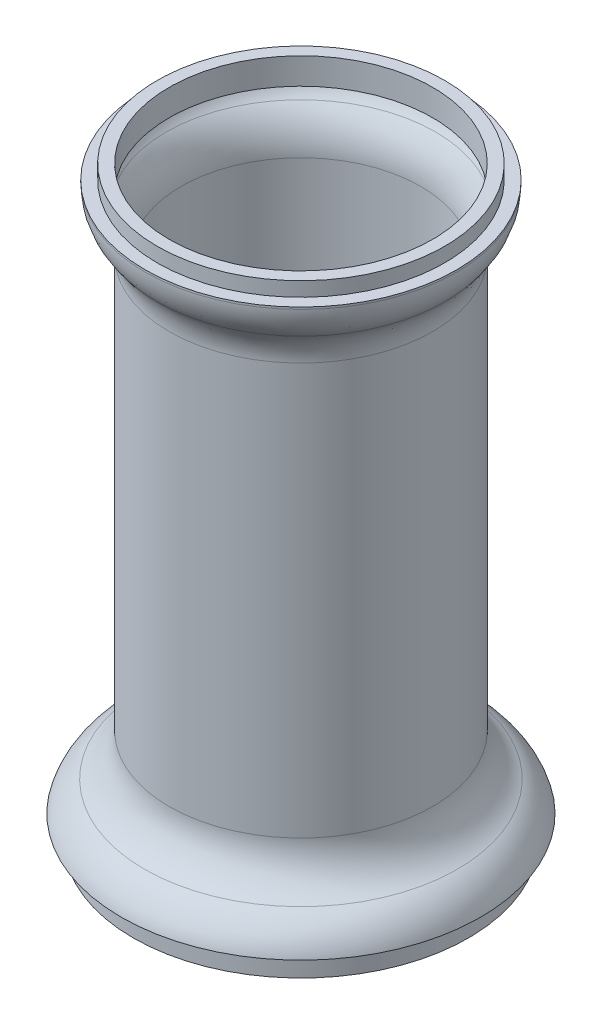
ISO-10303-21;
HEADER;
FILE_DESCRIPTION(('STEP AP214'),'2;1');
FILE_NAME('part.step','',(''),(''),'','','');
FILE_SCHEMA(('AUTOMOTIVE_DESIGN { 1 0 10303 214 1 1 1 1 }'));
ENDSEC;
DATA;
#1=APPLICATION_CONTEXT('core data for automotive mechanical design processes');
#2=APPLICATION_PROTOCOL_DEFINITION('international standard','automotive_design',2000,#1);
#3=PRODUCT_CONTEXT('',#1,'mechanical');
#4=PRODUCT('Part','Part','',(#3));
#5=PRODUCT_RELATED_PRODUCT_CATEGORY('part','',(#4));
#6=PRODUCT_DEFINITION_FORMATION('','',#4);
#7=PRODUCT_DEFINITION_CONTEXT('part definition',#1,'design');
#8=PRODUCT_DEFINITION('design','',#6,#7);
#9=PRODUCT_DEFINITION_SHAPE('','',#8);
#10=(LENGTH_UNIT() NAMED_UNIT(*) SI_UNIT(.MILLI.,.METRE.));
#11=(NAMED_UNIT(*) PLANE_ANGLE_UNIT() SI_UNIT($,.RADIAN.));
#12=(NAMED_UNIT(*) SI_UNIT($,.STERADIAN.) SOLID_ANGLE_UNIT());
#13=UNCERTAINTY_MEASURE_WITH_UNIT(LENGTH_MEASURE(1.E-05),#10,'distance_accuracy_value','');
#14=(GEOMETRIC_REPRESENTATION_CONTEXT(3) GLOBAL_UNCERTAINTY_ASSIGNED_CONTEXT((#13)) GLOBAL_UNIT_ASSIGNED_CONTEXT((#10,
#11,#12)) REPRESENTATION_CONTEXT('',''));
#15=CARTESIAN_POINT('',(0.,0.,0.));
#16=DIRECTION('',(0.,0.,1.));
#17=DIRECTION('',(1.,0.,0.));
#18=AXIS2_PLACEMENT_3D('',#15,#16,#17);
#19=CARTESIAN_POINT('',(0.,5.,0.));
#20=DIRECTION('',(0.,-1.,0.));
#21=DIRECTION('',(0.,0.,-1.));
#22=AXIS2_PLACEMENT_3D('',#19,#20,#21);
#23=CYLINDRICAL_SURFACE('',#22,35.);
#24=CARTESIAN_POINT('',(0.,5.,0.));
#25=DIRECTION('',(0.,1.,0.));
#26=DIRECTION('',(0.,0.,1.));
#27=AXIS2_PLACEMENT_3D('',#24,#25,#26);
#28=CIRCLE('',#27,35.);
#29=CARTESIAN_POINT('',(0.,5.,35.));
#30=VERTEX_POINT('',#29);
#31=EDGE_CURVE('E55',#30,#30,#28,.T.);
#32=ORIENTED_EDGE('',*,*,#31,.F.);
#33=EDGE_LOOP('',(#32));
#34=FACE_BOUND('',#33,.T.);
#35=CARTESIAN_POINT('',(0.,0.,0.));
#36=DIRECTION('',(0.,1.,0.));
#37=DIRECTION('',(0.,0.,1.));
#38=AXIS2_PLACEMENT_3D('',#35,#36,#37);
#39=CIRCLE('',#38,35.);
#40=CARTESIAN_POINT('',(0.,0.,35.));
#41=VERTEX_POINT('',#40);
#42=EDGE_CURVE('E56',#41,#41,#39,.T.);
#43=ORIENTED_EDGE('',*,*,#42,.T.);
#44=EDGE_LOOP('',(#43));
#45=FACE_BOUND('',#44,.T.);
#46=ADVANCED_FACE('F32',(#34,#45),#23,.T.);
#47=CARTESIAN_POINT('',(0.,0.,0.));
#48=DIRECTION('',(0.,1.,0.));
#49=DIRECTION('',(0.,0.,1.));
#50=AXIS2_PLACEMENT_3D('',#47,#48,#49);
#51=PLANE('',#50);
#52=CARTESIAN_POINT('',(0.,0.,0.));
#53=DIRECTION('',(0.,1.,0.));
#54=DIRECTION('',(0.,0.,1.));
#55=AXIS2_PLACEMENT_3D('',#52,#53,#54);
#56=CIRCLE('',#55,32.5);
#57=CARTESIAN_POINT('',(0.,0.,32.5));
#58=VERTEX_POINT('',#57);
#59=EDGE_CURVE('E82',#58,#58,#56,.T.);
#60=ORIENTED_EDGE('',*,*,#59,.T.);
#61=EDGE_LOOP('',(#60));
#62=FACE_BOUND('',#61,.T.);
#63=ORIENTED_EDGE('',*,*,#42,.F.);
#64=EDGE_LOOP('',(#63));
#65=FACE_BOUND('',#64,.T.);
#66=ADVANCED_FACE('F139',(#62,#65),#51,.F.);
#67=CARTESIAN_POINT('',(0.,5.,0.));
#68=DIRECTION('',(0.,1.,0.));
#69=DIRECTION('',(0.,0.,1.));
#70=AXIS2_PLACEMENT_3D('',#67,#68,#69);
#71=PLANE('',#70);
#72=ORIENTED_EDGE('',*,*,#31,.T.);
#73=EDGE_LOOP('',(#72));
#74=FACE_BOUND('',#73,.T.);
#75=CARTESIAN_POINT('',(0.,5.,0.));
#76=DIRECTION('',(0.,1.,0.));
#77=DIRECTION('',(0.,0.,1.));
#78=AXIS2_PLACEMENT_3D('',#75,#76,#77);
#79=CIRCLE('',#78,37.5);
#80=CARTESIAN_POINT('',(0.,5.,37.5));
#81=VERTEX_POINT('',#80);
#82=EDGE_CURVE('E59',#81,#81,#79,.T.);
#83=ORIENTED_EDGE('',*,*,#82,.F.);
#84=EDGE_LOOP('',(#83));
#85=FACE_BOUND('',#84,.T.);
#86=ADVANCED_FACE('F145',(#74,#85),#71,.F.);
#87=CARTESIAN_POINT('',(0.,114.5,0.));
#88=DIRECTION('',(0.,-1.,0.));
#89=DIRECTION('',(0.,0.,-1.));
#90=AXIS2_PLACEMENT_3D('',#87,#88,#89);
#91=CYLINDRICAL_SURFACE('',#90,27.5);
#92=CARTESIAN_POINT('',(0.,105.839745962156,0.));
#93=DIRECTION('',(0.,1.,0.));
#94=DIRECTION('',(0.,0.,1.));
#95=AXIS2_PLACEMENT_3D('',#92,#93,#94);
#96=CIRCLE('',#95,27.5);
#97=CARTESIAN_POINT('',(0.,105.839745962156,27.5));
#98=VERTEX_POINT('',#97);
#99=EDGE_CURVE('E47',#98,#98,#96,.F.);
#100=ORIENTED_EDGE('',*,*,#99,.T.);
#101=EDGE_LOOP('',(#100));
#102=FACE_BOUND('',#101,.T.);
#103=CARTESIAN_POINT('',(0.,20.,0.));
#104=DIRECTION('',(0.,1.,0.));
#105=DIRECTION('',(0.,0.,1.));
#106=AXIS2_PLACEMENT_3D('',#103,#104,#105);
#107=CIRCLE('',#106,27.5);
#108=CARTESIAN_POINT('',(0.,20.,27.5));
#109=VERTEX_POINT('',#108);
#110=EDGE_CURVE('E52',#109,#109,#107,.T.);
#111=ORIENTED_EDGE('',*,*,#110,.T.);
#112=EDGE_LOOP('',(#111));
#113=FACE_BOUND('',#112,.T.);
#114=ADVANCED_FACE('F173',(#102,#113),#91,.T.);
#115=CARTESIAN_POINT('',(0.,119.5,0.));
#116=DIRECTION('',(0.,-1.,0.));
#117=DIRECTION('',(0.,0.,-1.));
#118=AXIS2_PLACEMENT_3D('',#115,#116,#117);
#119=CYLINDRICAL_SURFACE('',#118,32.5);
#120=CARTESIAN_POINT('',(0.,119.068502517479,0.));
#121=DIRECTION('',(0.,-1.,0.));
#122=DIRECTION('',(0.,0.,-1.));
#123=AXIS2_PLACEMENT_3D('',#120,#121,#122);
#124=CIRCLE('',#123,32.5);
#125=CARTESIAN_POINT('',(0.,119.068502517479,-32.5));
#126=VERTEX_POINT('',#125);
#127=EDGE_CURVE('E39',#126,#126,#124,.F.);
#128=ORIENTED_EDGE('',*,*,#127,.T.);
#129=EDGE_LOOP('',(#128));
#130=FACE_BOUND('',#129,.T.);
#131=CARTESIAN_POINT('',(0.,119.5,0.));
#132=DIRECTION('',(0.,1.,0.));
#133=DIRECTION('',(0.,0.,1.));
#134=AXIS2_PLACEMENT_3D('',#131,#132,#133);
#135=CIRCLE('',#134,32.5);
#136=CARTESIAN_POINT('',(0.,119.5,32.5));
#137=VERTEX_POINT('',#136);
#138=EDGE_CURVE('E64',#137,#137,#135,.T.);
#139=ORIENTED_EDGE('',*,*,#138,.F.);
#140=EDGE_LOOP('',(#139));
#141=FACE_BOUND('',#140,.T.);
#142=ADVANCED_FACE('F175',(#130,#141),#119,.T.);
#143=CARTESIAN_POINT('',(0.,119.5,0.));
#144=DIRECTION('',(0.,1.,0.));
#145=DIRECTION('',(0.,0.,1.));
#146=AXIS2_PLACEMENT_3D('',#143,#144,#145);
#147=PLANE('',#146);
#148=CARTESIAN_POINT('',(0.,119.5,0.));
#149=DIRECTION('',(0.,1.,0.));
#150=DIRECTION('',(0.,0.,1.));
#151=AXIS2_PLACEMENT_3D('',#148,#149,#150);
#152=CIRCLE('',#151,30.);
#153=CARTESIAN_POINT('',(0.,119.5,30.));
#154=VERTEX_POINT('',#153);
#155=EDGE_CURVE('E68',#154,#154,#152,.T.);
#156=ORIENTED_EDGE('',*,*,#155,.F.);
#157=EDGE_LOOP('',(#156));
#158=FACE_BOUND('',#157,.T.);
#159=ORIENTED_EDGE('',*,*,#138,.T.);
#160=EDGE_LOOP('',(#159));
#161=FACE_BOUND('',#160,.T.);
#162=ADVANCED_FACE('F182',(#158,#161),#147,.T.);
#163=CARTESIAN_POINT('',(0.,122.5,0.));
#164=DIRECTION('',(0.,-1.,0.));
#165=DIRECTION('',(0.,0.,-1.));
#166=AXIS2_PLACEMENT_3D('',#163,#164,#165);
#167=CYLINDRICAL_SURFACE('',#166,30.);
#168=CARTESIAN_POINT('',(0.,122.5,0.));
#169=DIRECTION('',(0.,1.,0.));
#170=DIRECTION('',(0.,0.,1.));
#171=AXIS2_PLACEMENT_3D('',#168,#169,#170);
#172=CIRCLE('',#171,30.);
#173=CARTESIAN_POINT('',(0.,122.5,30.));
#174=VERTEX_POINT('',#173);
#175=EDGE_CURVE('E67',#174,#174,#172,.T.);
#176=ORIENTED_EDGE('',*,*,#175,.F.);
#177=EDGE_LOOP('',(#176));
#178=FACE_BOUND('',#177,.T.);
#179=ORIENTED_EDGE('',*,*,#155,.T.);
#180=EDGE_LOOP('',(#179));
#181=FACE_BOUND('',#180,.T.);
#182=ADVANCED_FACE('F188',(#178,#181),#167,.T.);
#183=CARTESIAN_POINT('',(0.,122.5,0.));
#184=DIRECTION('',(0.,1.,0.));
#185=DIRECTION('',(0.,0.,1.));
#186=AXIS2_PLACEMENT_3D('',#183,#184,#185);
#187=PLANE('',#186);
#188=CARTESIAN_POINT('',(0.,122.5,0.));
#189=DIRECTION('',(0.,1.,0.));
#190=DIRECTION('',(0.,0.,1.));
#191=AXIS2_PLACEMENT_3D('',#188,#189,#190);
#192=CIRCLE('',#191,27.5);
#193=CARTESIAN_POINT('',(0.,122.5,27.5));
#194=VERTEX_POINT('',#193);
#195=EDGE_CURVE('E77',#194,#194,#192,.T.);
#196=ORIENTED_EDGE('',*,*,#195,.F.);
#197=EDGE_LOOP('',(#196));
#198=FACE_BOUND('',#197,.T.);
#199=ORIENTED_EDGE('',*,*,#175,.T.);
#200=EDGE_LOOP('',(#199));
#201=FACE_BOUND('',#200,.T.);
#202=ADVANCED_FACE('F156',(#198,#201),#187,.T.);
#203=CARTESIAN_POINT('',(0.,105.839745962156,0.));
#204=DIRECTION('',(0.,1.,0.));
#205=DIRECTION('',(0.,0.,1.));
#206=AXIS2_PLACEMENT_3D('',#203,#204,#205);
#207=TOROIDAL_SURFACE('',#206,37.5,10.);
#208=CARTESIAN_POINT('',(0.,112.454124239817,0.));
#209=DIRECTION('',(0.,-1.,0.));
#210=DIRECTION('',(0.,0.,-1.));
#211=AXIS2_PLACEMENT_3D('',#208,#209,#210);
#212=CIRCLE('',#211,30.);
#213=CARTESIAN_POINT('',(0.,112.454124239817,-30.));
#214=VERTEX_POINT('',#213);
#215=EDGE_CURVE('E10',#214,#214,#212,.T.);
#216=ORIENTED_EDGE('',*,*,#215,.T.);
#217=EDGE_LOOP('',(#216));
#218=FACE_BOUND('',#217,.T.);
#219=ORIENTED_EDGE('',*,*,#99,.F.);
#220=EDGE_LOOP('',(#219));
#221=FACE_BOUND('',#220,.T.);
#222=ADVANCED_FACE('F152',(#218,#221),#207,.F.);
#223=CARTESIAN_POINT('',(0.,20.,0.));
#224=DIRECTION('',(0.,1.,0.));
#225=DIRECTION('',(0.,0.,1.));
#226=AXIS2_PLACEMENT_3D('',#223,#224,#225);
#227=TOROIDAL_SURFACE('',#226,37.5,10.);
#228=CARTESIAN_POINT('',(0.,11.2499999999999,0.));
#229=DIRECTION('',(0.,1.,0.));
#230=DIRECTION('',(0.,0.,1.));
#231=AXIS2_PLACEMENT_3D('',#228,#229,#230);
#232=CIRCLE('',#231,32.6587708172407);
#233=CARTESIAN_POINT('',(0.,11.2499999999999,32.6587708172407));
#234=VERTEX_POINT('',#233);
#235=EDGE_CURVE('E43',#234,#234,#232,.T.);
#236=ORIENTED_EDGE('',*,*,#235,.T.);
#237=EDGE_LOOP('',(#236));
#238=FACE_BOUND('',#237,.T.);
#239=ORIENTED_EDGE('',*,*,#110,.F.);
#240=EDGE_LOOP('',(#239));
#241=FACE_BOUND('',#240,.T.);
#242=ADVANCED_FACE('F155',(#238,#241),#227,.F.);
#243=CARTESIAN_POINT('',(0.,2.5,0.));
#244=DIRECTION('',(0.,1.,0.));
#245=DIRECTION('',(0.,0.,1.));
#246=AXIS2_PLACEMENT_3D('',#243,#244,#245);
#247=TOROIDAL_SURFACE('',#246,27.8175416344815,10.);
#248=ORIENTED_EDGE('',*,*,#82,.T.);
#249=EDGE_LOOP('',(#248));
#250=FACE_BOUND('',#249,.T.);
#251=ORIENTED_EDGE('',*,*,#235,.F.);
#252=EDGE_LOOP('',(#251));
#253=FACE_BOUND('',#252,.T.);
#254=ADVANCED_FACE('F158',(#250,#253),#247,.T.);
#255=CARTESIAN_POINT('',(0.,119.068502517479,0.));
#256=DIRECTION('',(0.,-1.,0.));
#257=DIRECTION('',(0.,0.,-1.));
#258=AXIS2_PLACEMENT_3D('',#255,#256,#257);
#259=TOROIDAL_SURFACE('',#258,22.5,10.);
#260=ORIENTED_EDGE('',*,*,#215,.F.);
#261=EDGE_LOOP('',(#260));
#262=FACE_BOUND('',#261,.T.);
#263=ORIENTED_EDGE('',*,*,#127,.F.);
#264=EDGE_LOOP('',(#263));
#265=FACE_BOUND('',#264,.T.);
#266=ADVANCED_FACE('F34',(#262,#265),#259,.T.);
#267=CARTESIAN_POINT('',(0.,119.068502517479,0.));
#268=DIRECTION('',(0.,-1.,0.));
#269=DIRECTION('',(0.,0.,-1.));
#270=AXIS2_PLACEMENT_3D('',#267,#268,#269);
#271=TOROIDAL_SURFACE('',#270,22.5,7.5);
#272=CARTESIAN_POINT('',(0.,114.107718809232,0.));
#273=DIRECTION('',(0.,1.,0.));
#274=DIRECTION('',(0.,0.,1.));
#275=AXIS2_PLACEMENT_3D('',#272,#273,#274);
#276=CIRCLE('',#275,28.125);
#277=CARTESIAN_POINT('',(0.,114.107718809232,28.125));
#278=VERTEX_POINT('',#277);
#279=EDGE_CURVE('E76',#278,#278,#276,.F.);
#280=ORIENTED_EDGE('',*,*,#279,.T.);
#281=EDGE_LOOP('',(#280));
#282=FACE_BOUND('',#281,.T.);
#283=CARTESIAN_POINT('',(0.,117.,0.));
#284=DIRECTION('',(0.,1.,0.));
#285=DIRECTION('',(0.,0.,1.));
#286=AXIS2_PLACEMENT_3D('',#283,#284,#285);
#287=CIRCLE('',#286,29.7091121044956);
#288=CARTESIAN_POINT('',(0.,117.,29.7091121044956));
#289=VERTEX_POINT('',#288);
#290=EDGE_CURVE('E71',#289,#289,#287,.F.);
#291=ORIENTED_EDGE('',*,*,#290,.F.);
#292=EDGE_LOOP('',(#291));
#293=FACE_BOUND('',#292,.T.);
#294=ADVANCED_FACE('F165',(#282,#293),#271,.F.);
#295=CARTESIAN_POINT('',(0.,5.,0.));
#296=DIRECTION('',(0.,-1.,0.));
#297=DIRECTION('',(0.,0.,-1.));
#298=AXIS2_PLACEMENT_3D('',#295,#296,#297);
#299=CYLINDRICAL_SURFACE('',#298,32.5);
#300=CARTESIAN_POINT('',(0.,7.5,0.));
#301=DIRECTION('',(0.,1.,0.));
#302=DIRECTION('',(0.,0.,1.));
#303=AXIS2_PLACEMENT_3D('',#300,#301,#302);
#304=CIRCLE('',#303,32.5);
#305=CARTESIAN_POINT('',(0.,7.5,32.5));
#306=VERTEX_POINT('',#305);
#307=EDGE_CURVE('E85',#306,#306,#304,.T.);
#308=ORIENTED_EDGE('',*,*,#307,.T.);
#309=EDGE_LOOP('',(#308));
#310=FACE_BOUND('',#309,.T.);
#311=ORIENTED_EDGE('',*,*,#59,.F.);
#312=EDGE_LOOP('',(#311));
#313=FACE_BOUND('',#312,.T.);
#314=ADVANCED_FACE('F104',(#310,#313),#299,.F.);
#315=CARTESIAN_POINT('',(0.,7.5,0.));
#316=DIRECTION('',(0.,1.,0.));
#317=DIRECTION('',(0.,0.,1.));
#318=AXIS2_PLACEMENT_3D('',#315,#316,#317);
#319=PLANE('',#318);
#320=ORIENTED_EDGE('',*,*,#307,.F.);
#321=EDGE_LOOP('',(#320));
#322=FACE_BOUND('',#321,.T.);
#323=CARTESIAN_POINT('',(0.,7.5,0.));
#324=DIRECTION('',(0.,1.,0.));
#325=DIRECTION('',(0.,0.,1.));
#326=AXIS2_PLACEMENT_3D('',#323,#324,#325);
#327=CIRCLE('',#326,33.4077115782309);
#328=CARTESIAN_POINT('',(0.,7.5,33.4077115782309));
#329=VERTEX_POINT('',#328);
#330=EDGE_CURVE('E80',#329,#329,#327,.T.);
#331=ORIENTED_EDGE('',*,*,#330,.T.);
#332=EDGE_LOOP('',(#331));
#333=FACE_BOUND('',#332,.T.);
#334=ADVANCED_FACE('F107',(#322,#333),#319,.T.);
#335=CARTESIAN_POINT('',(0.,114.5,0.));
#336=DIRECTION('',(0.,-1.,0.));
#337=DIRECTION('',(0.,0.,-1.));
#338=AXIS2_PLACEMENT_3D('',#335,#336,#337);
#339=CYLINDRICAL_SURFACE('',#338,25.);
#340=CARTESIAN_POINT('',(0.,105.839745962156,0.));
#341=DIRECTION('',(0.,-1.,0.));
#342=DIRECTION('',(0.,0.,-1.));
#343=AXIS2_PLACEMENT_3D('',#340,#341,#342);
#344=CIRCLE('',#343,25.);
#345=CARTESIAN_POINT('',(0.,105.839745962156,-25.));
#346=VERTEX_POINT('',#345);
#347=EDGE_CURVE('E91',#346,#346,#344,.T.);
#348=ORIENTED_EDGE('',*,*,#347,.F.);
#349=EDGE_LOOP('',(#348));
#350=FACE_BOUND('',#349,.T.);
#351=CARTESIAN_POINT('',(0.,20.,0.));
#352=DIRECTION('',(0.,-1.,0.));
#353=DIRECTION('',(0.,0.,-1.));
#354=AXIS2_PLACEMENT_3D('',#351,#352,#353);
#355=CIRCLE('',#354,25.);
#356=CARTESIAN_POINT('',(0.,20.,-25.));
#357=VERTEX_POINT('',#356);
#358=EDGE_CURVE('E94',#357,#357,#355,.F.);
#359=ORIENTED_EDGE('',*,*,#358,.F.);
#360=EDGE_LOOP('',(#359));
#361=FACE_BOUND('',#360,.T.);
#362=ADVANCED_FACE('F110',(#350,#361),#339,.F.);
#363=CARTESIAN_POINT('',(0.,117.,0.));
#364=DIRECTION('',(0.,1.,0.));
#365=DIRECTION('',(0.,0.,1.));
#366=AXIS2_PLACEMENT_3D('',#363,#364,#365);
#367=PLANE('',#366);
#368=ORIENTED_EDGE('',*,*,#290,.T.);
#369=EDGE_LOOP('',(#368));
#370=FACE_BOUND('',#369,.T.);
#371=CARTESIAN_POINT('',(0.,117.,0.));
#372=DIRECTION('',(0.,1.,0.));
#373=DIRECTION('',(0.,0.,1.));
#374=AXIS2_PLACEMENT_3D('',#371,#372,#373);
#375=CIRCLE('',#374,27.5);
#376=CARTESIAN_POINT('',(0.,117.,27.5));
#377=VERTEX_POINT('',#376);
#378=EDGE_CURVE('E81',#377,#377,#375,.T.);
#379=ORIENTED_EDGE('',*,*,#378,.T.);
#380=EDGE_LOOP('',(#379));
#381=FACE_BOUND('',#380,.T.);
#382=ADVANCED_FACE('F128',(#370,#381),#367,.F.);
#383=CARTESIAN_POINT('',(0.,122.5,0.));
#384=DIRECTION('',(0.,-1.,0.));
#385=DIRECTION('',(0.,0.,-1.));
#386=AXIS2_PLACEMENT_3D('',#383,#384,#385);
#387=CYLINDRICAL_SURFACE('',#386,27.5);
#388=ORIENTED_EDGE('',*,*,#195,.T.);
#389=EDGE_LOOP('',(#388));
#390=FACE_BOUND('',#389,.T.);
#391=ORIENTED_EDGE('',*,*,#378,.F.);
#392=EDGE_LOOP('',(#391));
#393=FACE_BOUND('',#392,.T.);
#394=ADVANCED_FACE('F134',(#390,#393),#387,.F.);
#395=CARTESIAN_POINT('',(0.,105.839745962156,0.));
#396=DIRECTION('',(0.,1.,0.));
#397=DIRECTION('',(0.,0.,1.));
#398=AXIS2_PLACEMENT_3D('',#395,#396,#397);
#399=TOROIDAL_SURFACE('',#398,37.5,12.5);
#400=ORIENTED_EDGE('',*,*,#279,.F.);
#401=EDGE_LOOP('',(#400));
#402=FACE_BOUND('',#401,.T.);
#403=ORIENTED_EDGE('',*,*,#347,.T.);
#404=EDGE_LOOP('',(#403));
#405=FACE_BOUND('',#404,.T.);
#406=ADVANCED_FACE('F123',(#402,#405),#399,.T.);
#407=CARTESIAN_POINT('',(0.,20.,0.));
#408=DIRECTION('',(0.,1.,0.));
#409=DIRECTION('',(0.,0.,1.));
#410=AXIS2_PLACEMENT_3D('',#407,#408,#409);
#411=TOROIDAL_SURFACE('',#410,37.5,12.5);
#412=CARTESIAN_POINT('',(0.,9.0625,0.));
#413=DIRECTION('',(0.,1.,0.));
#414=DIRECTION('',(0.,0.,1.));
#415=AXIS2_PLACEMENT_3D('',#412,#413,#414);
#416=CIRCLE('',#415,31.4484635215509);
#417=CARTESIAN_POINT('',(0.,9.0625,31.4484635215509));
#418=VERTEX_POINT('',#417);
#419=EDGE_CURVE('E90',#418,#418,#416,.T.);
#420=ORIENTED_EDGE('',*,*,#419,.F.);
#421=EDGE_LOOP('',(#420));
#422=FACE_BOUND('',#421,.T.);
#423=ORIENTED_EDGE('',*,*,#358,.T.);
#424=EDGE_LOOP('',(#423));
#425=FACE_BOUND('',#424,.T.);
#426=ADVANCED_FACE('F117',(#422,#425),#411,.T.);
#427=CARTESIAN_POINT('',(0.,2.5,0.));
#428=DIRECTION('',(0.,1.,0.));
#429=DIRECTION('',(0.,0.,1.));
#430=AXIS2_PLACEMENT_3D('',#427,#428,#429);
#431=TOROIDAL_SURFACE('',#430,27.8175416344815,7.5);
#432=ORIENTED_EDGE('',*,*,#330,.F.);
#433=EDGE_LOOP('',(#432));
#434=FACE_BOUND('',#433,.T.);
#435=ORIENTED_EDGE('',*,*,#419,.T.);
#436=EDGE_LOOP('',(#435));
#437=FACE_BOUND('',#436,.T.);
#438=ADVANCED_FACE('F114',(#434,#437),#431,.F.);
#439=CLOSED_SHELL('',(#46,#66,#86,#114,#142,#162,#182,#202,#222,#242,#254,#266,#294,#314,#334,
#362,#382,#394,#406,#426,#438));
#440=MANIFOLD_SOLID_BREP('B2',#439);
#441=ADVANCED_BREP_SHAPE_REPRESENTATION('',(#18,#440),#14);
#442=SHAPE_DEFINITION_REPRESENTATION(#9,#441);
ENDSEC;
END-ISO-10303-21;
